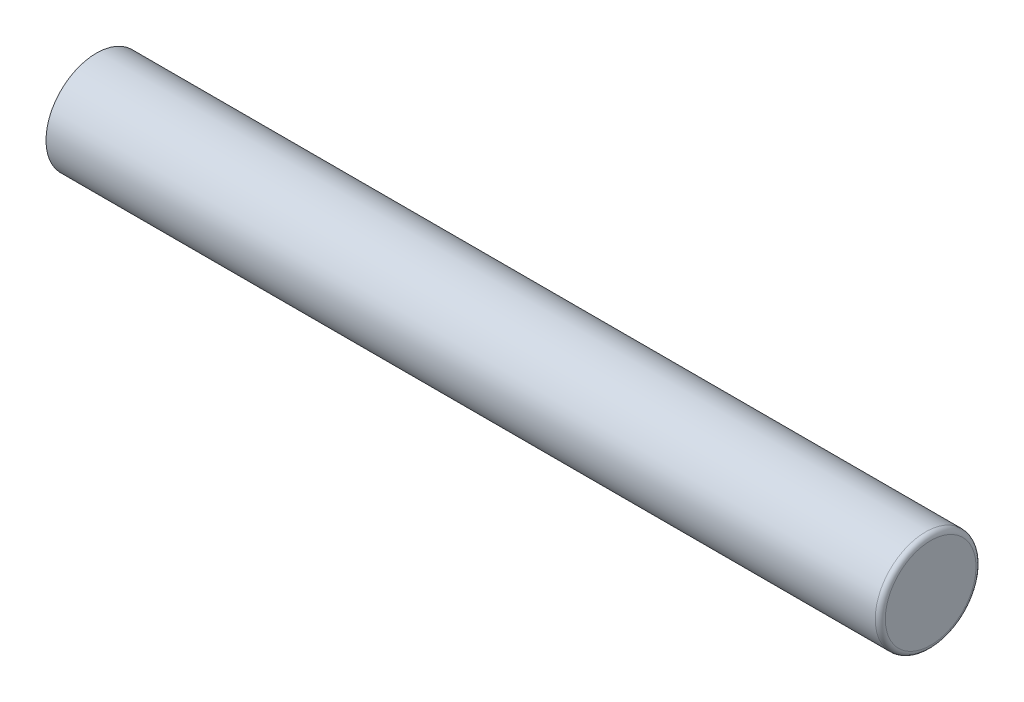
ISO-10303-21;
HEADER;
FILE_DESCRIPTION(('STEP AP214'),'2;1');
FILE_NAME('part.step','',(''),(''),'','','');
FILE_SCHEMA(('AUTOMOTIVE_DESIGN { 1 0 10303 214 1 1 1 1 }'));
ENDSEC;
DATA;
#1=APPLICATION_CONTEXT('core data for automotive mechanical design processes');
#2=APPLICATION_PROTOCOL_DEFINITION('international standard','automotive_design',2000,#1);
#3=PRODUCT_CONTEXT('',#1,'mechanical');
#4=PRODUCT('Part','Part','',(#3));
#5=PRODUCT_RELATED_PRODUCT_CATEGORY('part','',(#4));
#6=PRODUCT_DEFINITION_FORMATION('','',#4);
#7=PRODUCT_DEFINITION_CONTEXT('part definition',#1,'design');
#8=PRODUCT_DEFINITION('design','',#6,#7);
#9=PRODUCT_DEFINITION_SHAPE('','',#8);
#10=(LENGTH_UNIT() NAMED_UNIT(*) SI_UNIT(.MILLI.,.METRE.));
#11=(NAMED_UNIT(*) PLANE_ANGLE_UNIT() SI_UNIT($,.RADIAN.));
#12=(NAMED_UNIT(*) SI_UNIT($,.STERADIAN.) SOLID_ANGLE_UNIT());
#13=UNCERTAINTY_MEASURE_WITH_UNIT(LENGTH_MEASURE(1.E-05),#10,'distance_accuracy_value','');
#14=(GEOMETRIC_REPRESENTATION_CONTEXT(3) GLOBAL_UNCERTAINTY_ASSIGNED_CONTEXT((#13)) GLOBAL_UNIT_ASSIGNED_CONTEXT((#10,
#11,#12)) REPRESENTATION_CONTEXT('',''));
#15=CARTESIAN_POINT('',(0.,0.,0.));
#16=DIRECTION('',(0.,0.,1.));
#17=DIRECTION('',(1.,0.,0.));
#18=AXIS2_PLACEMENT_3D('',#15,#16,#17);
#19=CARTESIAN_POINT('',(0.,0.,0.));
#20=DIRECTION('',(1.,0.,0.));
#21=DIRECTION('',(0.,0.,-1.));
#22=AXIS2_PLACEMENT_3D('',#19,#20,#21);
#23=PLANE('',#22);
#24=CARTESIAN_POINT('',(0.,0.,0.));
#25=DIRECTION('',(-1.,0.,0.));
#26=DIRECTION('',(0.,0.,1.));
#27=AXIS2_PLACEMENT_3D('',#24,#25,#26);
#28=CIRCLE('',#27,2.5);
#29=CARTESIAN_POINT('',(0.,0.,2.5));
#30=VERTEX_POINT('',#29);
#31=EDGE_CURVE('E48',#30,#30,#28,.T.);
#32=ORIENTED_EDGE('',*,*,#31,.T.);
#33=EDGE_LOOP('',(#32));
#34=FACE_BOUND('',#33,.T.);
#35=ADVANCED_FACE('F37',(#34),#23,.F.);
#36=CARTESIAN_POINT('',(0.,0.,0.));
#37=DIRECTION('',(-1.,0.,0.));
#38=DIRECTION('',(0.,0.,1.));
#39=AXIS2_PLACEMENT_3D('',#36,#37,#38);
#40=CYLINDRICAL_SURFACE('',#39,2.5);
#41=CARTESIAN_POINT('',(41.15,0.,0.));
#42=DIRECTION('',(-1.,0.,0.));
#43=DIRECTION('',(0.,0.,1.));
#44=AXIS2_PLACEMENT_3D('',#41,#42,#43);
#45=CIRCLE('',#44,2.5);
#46=CARTESIAN_POINT('',(41.15,0.,2.5));
#47=VERTEX_POINT('',#46);
#48=EDGE_CURVE('E44',#47,#47,#45,.T.);
#49=ORIENTED_EDGE('',*,*,#48,.T.);
#50=EDGE_LOOP('',(#49));
#51=FACE_BOUND('',#50,.T.);
#52=ORIENTED_EDGE('',*,*,#31,.F.);
#53=EDGE_LOOP('',(#52));
#54=FACE_BOUND('',#53,.T.);
#55=ADVANCED_FACE('F56',(#51,#54),#40,.T.);
#56=CARTESIAN_POINT('',(41.4,0.,0.));
#57=DIRECTION('',(-1.,0.,0.));
#58=DIRECTION('',(0.,0.,1.));
#59=AXIS2_PLACEMENT_3D('',#56,#57,#58);
#60=PLANE('',#59);
#61=CARTESIAN_POINT('',(41.4,0.,0.));
#62=DIRECTION('',(-1.,0.,0.));
#63=DIRECTION('',(0.,0.,1.));
#64=AXIS2_PLACEMENT_3D('',#61,#62,#63);
#65=CIRCLE('',#64,2.25);
#66=CARTESIAN_POINT('',(41.4,0.,2.25));
#67=VERTEX_POINT('',#66);
#68=EDGE_CURVE('E10',#67,#67,#65,.F.);
#69=ORIENTED_EDGE('',*,*,#68,.T.);
#70=EDGE_LOOP('',(#69));
#71=FACE_BOUND('',#70,.T.);
#72=ADVANCED_FACE('F58',(#71),#60,.F.);
#73=CARTESIAN_POINT('',(41.15,0.,0.));
#74=DIRECTION('',(-1.,0.,0.));
#75=DIRECTION('',(0.,0.,1.));
#76=AXIS2_PLACEMENT_3D('',#73,#74,#75);
#77=TOROIDAL_SURFACE('',#76,2.25,0.25);
#78=ORIENTED_EDGE('',*,*,#68,.F.);
#79=EDGE_LOOP('',(#78));
#80=FACE_BOUND('',#79,.T.);
#81=ORIENTED_EDGE('',*,*,#48,.F.);
#82=EDGE_LOOP('',(#81));
#83=FACE_BOUND('',#82,.T.);
#84=ADVANCED_FACE('F39',(#80,#83),#77,.T.);
#85=CLOSED_SHELL('',(#35,#55,#72,#84));
#86=MANIFOLD_SOLID_BREP('B2',#85);
#87=ADVANCED_BREP_SHAPE_REPRESENTATION('',(#18,#86),#14);
#88=SHAPE_DEFINITION_REPRESENTATION(#9,#87);
ENDSEC;
END-ISO-10303-21;
